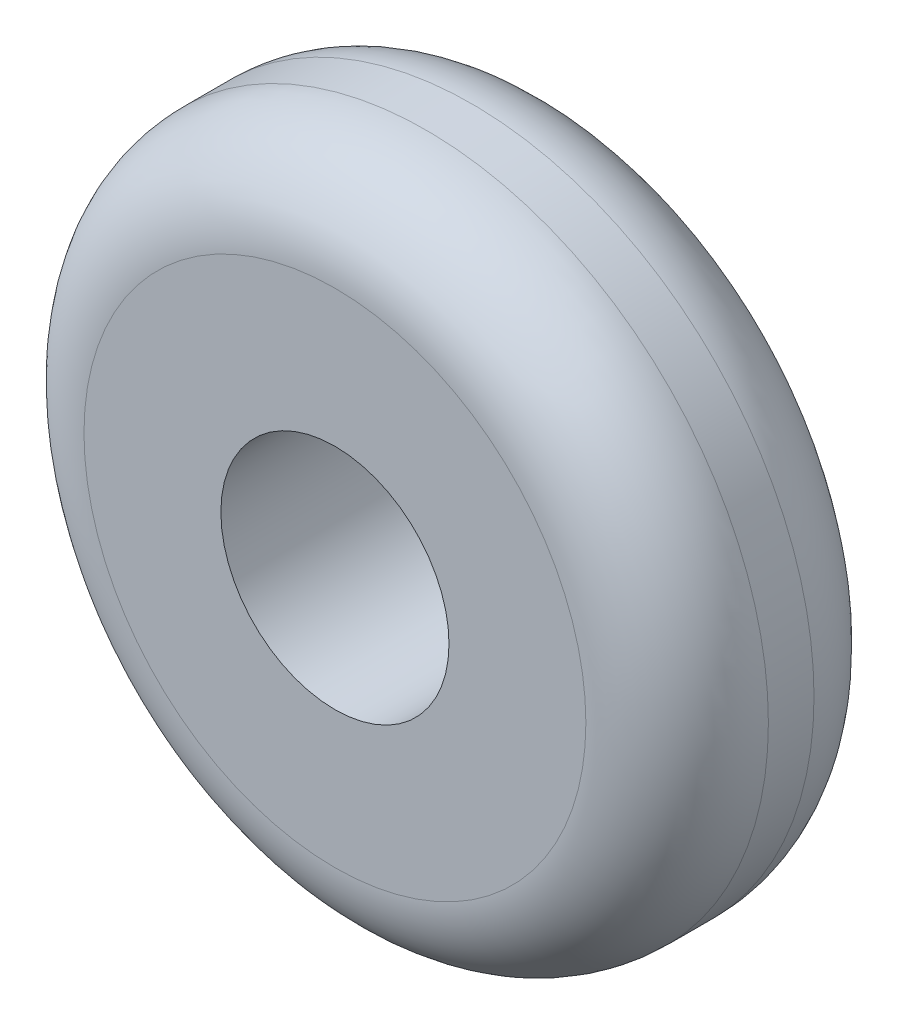
ISO-10303-21;
HEADER;
FILE_DESCRIPTION(('STEP AP214'),'2;1');
FILE_NAME('part.step','',(''),(''),'','','');
FILE_SCHEMA(('AUTOMOTIVE_DESIGN { 1 0 10303 214 1 1 1 1 }'));
ENDSEC;
DATA;
#1=APPLICATION_CONTEXT('core data for automotive mechanical design processes');
#2=APPLICATION_PROTOCOL_DEFINITION('international standard','automotive_design',2000,#1);
#3=PRODUCT_CONTEXT('',#1,'mechanical');
#4=PRODUCT('Part','Part','',(#3));
#5=PRODUCT_RELATED_PRODUCT_CATEGORY('part','',(#4));
#6=PRODUCT_DEFINITION_FORMATION('','',#4);
#7=PRODUCT_DEFINITION_CONTEXT('part definition',#1,'design');
#8=PRODUCT_DEFINITION('design','',#6,#7);
#9=PRODUCT_DEFINITION_SHAPE('','',#8);
#10=(LENGTH_UNIT() NAMED_UNIT(*) SI_UNIT(.MILLI.,.METRE.));
#11=(NAMED_UNIT(*) PLANE_ANGLE_UNIT() SI_UNIT($,.RADIAN.));
#12=(NAMED_UNIT(*) SI_UNIT($,.STERADIAN.) SOLID_ANGLE_UNIT());
#13=UNCERTAINTY_MEASURE_WITH_UNIT(LENGTH_MEASURE(1.E-05),#10,'distance_accuracy_value','');
#14=(GEOMETRIC_REPRESENTATION_CONTEXT(3) GLOBAL_UNCERTAINTY_ASSIGNED_CONTEXT((#13)) GLOBAL_UNIT_ASSIGNED_CONTEXT((#10,
#11,#12)) REPRESENTATION_CONTEXT('',''));
#15=CARTESIAN_POINT('',(0.,0.,0.));
#16=DIRECTION('',(0.,0.,1.));
#17=DIRECTION('',(1.,0.,0.));
#18=AXIS2_PLACEMENT_3D('',#15,#16,#17);
#19=CARTESIAN_POINT('',(0.,0.,5.));
#20=DIRECTION('',(0.,0.,1.));
#21=DIRECTION('',(1.,0.,0.));
#22=AXIS2_PLACEMENT_3D('',#19,#20,#21);
#23=PLANE('',#22);
#24=CARTESIAN_POINT('',(0.,0.,5.));
#25=DIRECTION('',(0.,0.,1.));
#26=DIRECTION('',(1.,0.,0.));
#27=AXIS2_PLACEMENT_3D('',#24,#25,#26);
#28=CIRCLE('',#27,5.5);
#29=CARTESIAN_POINT('',(5.5,0.,5.));
#30=VERTEX_POINT('',#29);
#31=EDGE_CURVE('E50',#30,#30,#28,.T.);
#32=ORIENTED_EDGE('',*,*,#31,.T.);
#33=EDGE_LOOP('',(#32));
#34=FACE_BOUND('',#33,.T.);
#35=CARTESIAN_POINT('',(0.,0.,5.));
#36=DIRECTION('',(0.,0.,1.));
#37=DIRECTION('',(1.,0.,0.));
#38=AXIS2_PLACEMENT_3D('',#35,#36,#37);
#39=CIRCLE('',#38,2.5);
#40=CARTESIAN_POINT('',(2.5,0.,5.));
#41=VERTEX_POINT('',#40);
#42=EDGE_CURVE('E55',#41,#41,#39,.T.);
#43=ORIENTED_EDGE('',*,*,#42,.F.);
#44=EDGE_LOOP('',(#43));
#45=FACE_BOUND('',#44,.T.);
#46=ADVANCED_FACE('F35',(#34,#45),#23,.T.);
#47=CARTESIAN_POINT('',(0.,0.,0.));
#48=DIRECTION('',(0.,0.,1.));
#49=DIRECTION('',(1.,0.,0.));
#50=AXIS2_PLACEMENT_3D('',#47,#48,#49);
#51=PLANE('',#50);
#52=CARTESIAN_POINT('',(0.,0.,0.));
#53=DIRECTION('',(0.,0.,1.));
#54=DIRECTION('',(1.,0.,0.));
#55=AXIS2_PLACEMENT_3D('',#52,#53,#54);
#56=CIRCLE('',#55,5.5);
#57=CARTESIAN_POINT('',(5.5,0.,0.));
#58=VERTEX_POINT('',#57);
#59=EDGE_CURVE('E10',#58,#58,#56,.F.);
#60=ORIENTED_EDGE('',*,*,#59,.T.);
#61=EDGE_LOOP('',(#60));
#62=FACE_BOUND('',#61,.T.);
#63=CARTESIAN_POINT('',(0.,0.,0.));
#64=DIRECTION('',(0.,0.,1.));
#65=DIRECTION('',(1.,0.,0.));
#66=AXIS2_PLACEMENT_3D('',#63,#64,#65);
#67=CIRCLE('',#66,2.5);
#68=CARTESIAN_POINT('',(2.5,0.,0.));
#69=VERTEX_POINT('',#68);
#70=EDGE_CURVE('E56',#69,#69,#67,.T.);
#71=ORIENTED_EDGE('',*,*,#70,.T.);
#72=EDGE_LOOP('',(#71));
#73=FACE_BOUND('',#72,.T.);
#74=ADVANCED_FACE('F66',(#62,#73),#51,.F.);
#75=CARTESIAN_POINT('',(0.,0.,5.));
#76=DIRECTION('',(0.,0.,-1.));
#77=DIRECTION('',(-1.,0.,0.));
#78=AXIS2_PLACEMENT_3D('',#75,#76,#77);
#79=CYLINDRICAL_SURFACE('',#78,7.5);
#80=CARTESIAN_POINT('',(0.,0.,3.));
#81=DIRECTION('',(0.,0.,1.));
#82=DIRECTION('',(1.,0.,0.));
#83=AXIS2_PLACEMENT_3D('',#80,#81,#82);
#84=CIRCLE('',#83,7.5);
#85=CARTESIAN_POINT('',(7.5,0.,3.));
#86=VERTEX_POINT('',#85);
#87=EDGE_CURVE('E42',#86,#86,#84,.F.);
#88=ORIENTED_EDGE('',*,*,#87,.T.);
#89=EDGE_LOOP('',(#88));
#90=FACE_BOUND('',#89,.T.);
#91=CARTESIAN_POINT('',(0.,0.,2.));
#92=DIRECTION('',(0.,0.,1.));
#93=DIRECTION('',(1.,0.,0.));
#94=AXIS2_PLACEMENT_3D('',#91,#92,#93);
#95=CIRCLE('',#94,7.5);
#96=CARTESIAN_POINT('',(7.5,0.,2.));
#97=VERTEX_POINT('',#96);
#98=EDGE_CURVE('E46',#97,#97,#95,.T.);
#99=ORIENTED_EDGE('',*,*,#98,.T.);
#100=EDGE_LOOP('',(#99));
#101=FACE_BOUND('',#100,.T.);
#102=ADVANCED_FACE('F72',(#90,#101),#79,.T.);
#103=CARTESIAN_POINT('',(0.,0.,5.));
#104=DIRECTION('',(0.,0.,-1.));
#105=DIRECTION('',(-1.,0.,0.));
#106=AXIS2_PLACEMENT_3D('',#103,#104,#105);
#107=CYLINDRICAL_SURFACE('',#106,2.5);
#108=ORIENTED_EDGE('',*,*,#42,.T.);
#109=EDGE_LOOP('',(#108));
#110=FACE_BOUND('',#109,.T.);
#111=ORIENTED_EDGE('',*,*,#70,.F.);
#112=EDGE_LOOP('',(#111));
#113=FACE_BOUND('',#112,.T.);
#114=ADVANCED_FACE('F62',(#110,#113),#107,.F.);
#115=CARTESIAN_POINT('',(0.,0.,3.));
#116=DIRECTION('',(0.,0.,1.));
#117=DIRECTION('',(1.,0.,0.));
#118=AXIS2_PLACEMENT_3D('',#115,#116,#117);
#119=TOROIDAL_SURFACE('',#118,5.5,2.);
#120=ORIENTED_EDGE('',*,*,#87,.F.);
#121=EDGE_LOOP('',(#120));
#122=FACE_BOUND('',#121,.T.);
#123=ORIENTED_EDGE('',*,*,#31,.F.);
#124=EDGE_LOOP('',(#123));
#125=FACE_BOUND('',#124,.T.);
#126=ADVANCED_FACE('F77',(#122,#125),#119,.T.);
#127=CARTESIAN_POINT('',(0.,0.,2.));
#128=DIRECTION('',(0.,0.,1.));
#129=DIRECTION('',(1.,0.,0.));
#130=AXIS2_PLACEMENT_3D('',#127,#128,#129);
#131=TOROIDAL_SURFACE('',#130,5.5,2.);
#132=ORIENTED_EDGE('',*,*,#59,.F.);
#133=EDGE_LOOP('',(#132));
#134=FACE_BOUND('',#133,.T.);
#135=ORIENTED_EDGE('',*,*,#98,.F.);
#136=EDGE_LOOP('',(#135));
#137=FACE_BOUND('',#136,.T.);
#138=ADVANCED_FACE('F37',(#134,#137),#131,.T.);
#139=CLOSED_SHELL('',(#46,#74,#102,#114,#126,#138));
#140=MANIFOLD_SOLID_BREP('B2',#139);
#141=ADVANCED_BREP_SHAPE_REPRESENTATION('',(#18,#140),#14);
#142=SHAPE_DEFINITION_REPRESENTATION(#9,#141);
ENDSEC;
END-ISO-10303-21;
